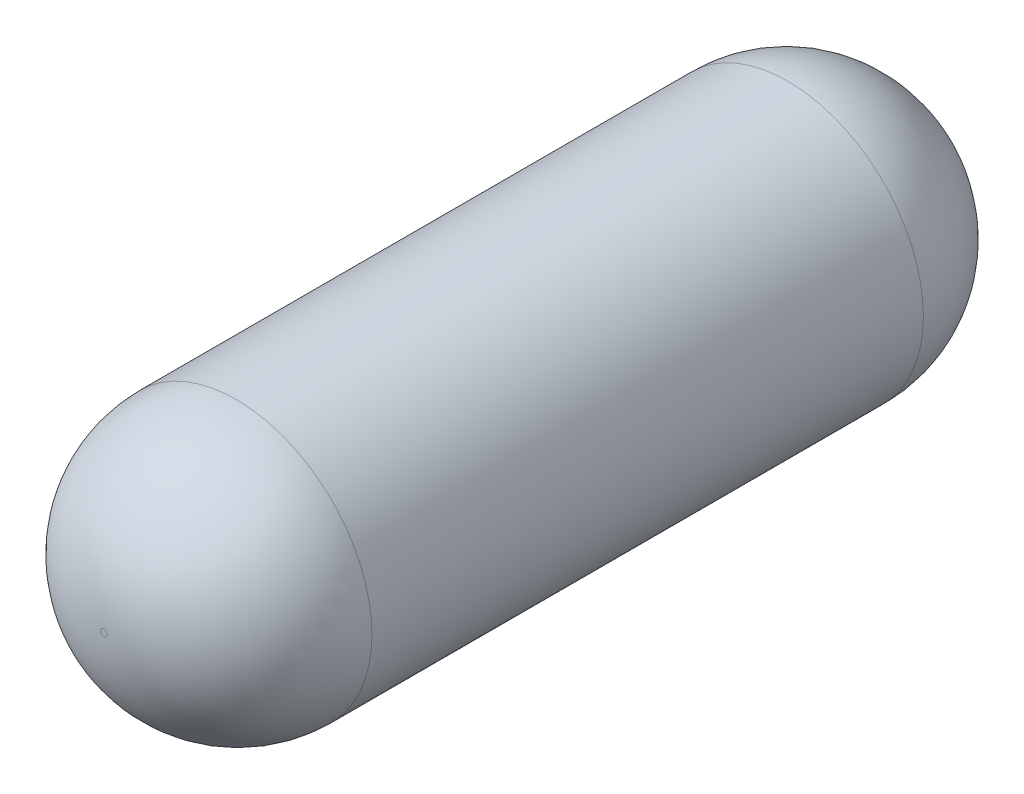
ISO-10303-21;
HEADER;
FILE_DESCRIPTION(('STEP AP214'),'2;1');
FILE_NAME('part.step','',(''),(''),'','','');
FILE_SCHEMA(('AUTOMOTIVE_DESIGN { 1 0 10303 214 1 1 1 1 }'));
ENDSEC;
DATA;
#1=APPLICATION_CONTEXT('core data for automotive mechanical design processes');
#2=APPLICATION_PROTOCOL_DEFINITION('international standard','automotive_design',2000,#1);
#3=PRODUCT_CONTEXT('',#1,'mechanical');
#4=PRODUCT('Part','Part','',(#3));
#5=PRODUCT_RELATED_PRODUCT_CATEGORY('part','',(#4));
#6=PRODUCT_DEFINITION_FORMATION('','',#4);
#7=PRODUCT_DEFINITION_CONTEXT('part definition',#1,'design');
#8=PRODUCT_DEFINITION('design','',#6,#7);
#9=PRODUCT_DEFINITION_SHAPE('','',#8);
#10=(LENGTH_UNIT() NAMED_UNIT(*) SI_UNIT(.MILLI.,.METRE.));
#11=(NAMED_UNIT(*) PLANE_ANGLE_UNIT() SI_UNIT($,.RADIAN.));
#12=(NAMED_UNIT(*) SI_UNIT($,.STERADIAN.) SOLID_ANGLE_UNIT());
#13=UNCERTAINTY_MEASURE_WITH_UNIT(LENGTH_MEASURE(1.E-05),#10,'distance_accuracy_value','');
#14=(GEOMETRIC_REPRESENTATION_CONTEXT(3) GLOBAL_UNCERTAINTY_ASSIGNED_CONTEXT((#13)) GLOBAL_UNIT_ASSIGNED_CONTEXT((#10,
#11,#12)) REPRESENTATION_CONTEXT('',''));
#15=CARTESIAN_POINT('',(0.,0.,0.));
#16=DIRECTION('',(0.,0.,1.));
#17=DIRECTION('',(1.,0.,0.));
#18=AXIS2_PLACEMENT_3D('',#15,#16,#17);
#19=CARTESIAN_POINT('',(0.,0.,370.));
#20=DIRECTION('',(0.,0.,-1.));
#21=DIRECTION('',(-1.,0.,0.));
#22=AXIS2_PLACEMENT_3D('',#19,#20,#21);
#23=CYLINDRICAL_SURFACE('',#22,61.5);
#24=CARTESIAN_POINT('',(0.,0.,60.));
#25=DIRECTION('',(0.,0.,1.));
#26=DIRECTION('',(1.,0.,0.));
#27=AXIS2_PLACEMENT_3D('',#24,#25,#26);
#28=CIRCLE('',#27,61.5);
#29=CARTESIAN_POINT('',(61.5,0.,60.));
#30=VERTEX_POINT('',#29);
#31=EDGE_CURVE('E50',#30,#30,#28,.T.);
#32=ORIENTED_EDGE('',*,*,#31,.T.);
#33=EDGE_LOOP('',(#32));
#34=FACE_BOUND('',#33,.T.);
#35=CARTESIAN_POINT('',(0.,0.,310.));
#36=DIRECTION('',(0.,0.,1.));
#37=DIRECTION('',(1.,0.,0.));
#38=AXIS2_PLACEMENT_3D('',#35,#36,#37);
#39=CIRCLE('',#38,61.5);
#40=CARTESIAN_POINT('',(61.5,0.,310.));
#41=VERTEX_POINT('',#40);
#42=EDGE_CURVE('E54',#41,#41,#39,.F.);
#43=ORIENTED_EDGE('',*,*,#42,.T.);
#44=EDGE_LOOP('',(#43));
#45=FACE_BOUND('',#44,.T.);
#46=ADVANCED_FACE('F39',(#34,#45),#23,.T.);
#47=CARTESIAN_POINT('',(0.,0.,370.));
#48=DIRECTION('',(0.,0.,1.));
#49=DIRECTION('',(1.,0.,0.));
#50=AXIS2_PLACEMENT_3D('',#47,#48,#49);
#51=PLANE('',#50);
#52=CARTESIAN_POINT('',(0.,0.,370.));
#53=DIRECTION('',(0.,0.,1.));
#54=DIRECTION('',(1.,0.,0.));
#55=AXIS2_PLACEMENT_3D('',#52,#53,#54);
#56=CIRCLE('',#55,1.50000000000001);
#57=CARTESIAN_POINT('',(1.50000000000001,0.,370.));
#58=VERTEX_POINT('',#57);
#59=EDGE_CURVE('E10',#58,#58,#56,.T.);
#60=ORIENTED_EDGE('',*,*,#59,.T.);
#61=EDGE_LOOP('',(#60));
#62=FACE_BOUND('',#61,.T.);
#63=ADVANCED_FACE('F70',(#62),#51,.T.);
#64=CARTESIAN_POINT('',(0.,0.,0.));
#65=DIRECTION('',(0.,0.,1.));
#66=DIRECTION('',(1.,0.,0.));
#67=AXIS2_PLACEMENT_3D('',#64,#65,#66);
#68=PLANE('',#67);
#69=CARTESIAN_POINT('',(0.,0.,0.));
#70=DIRECTION('',(0.,0.,1.));
#71=DIRECTION('',(1.,0.,0.));
#72=AXIS2_PLACEMENT_3D('',#69,#70,#71);
#73=CIRCLE('',#72,1.50000000000001);
#74=CARTESIAN_POINT('',(1.50000000000001,0.,0.));
#75=VERTEX_POINT('',#74);
#76=EDGE_CURVE('E46',#75,#75,#73,.F.);
#77=ORIENTED_EDGE('',*,*,#76,.T.);
#78=EDGE_LOOP('',(#77));
#79=FACE_BOUND('',#78,.T.);
#80=ADVANCED_FACE('F67',(#79),#68,.F.);
#81=CARTESIAN_POINT('',(0.,0.,60.));
#82=DIRECTION('',(0.,0.,1.));
#83=DIRECTION('',(1.,0.,0.));
#84=AXIS2_PLACEMENT_3D('',#81,#82,#83);
#85=DEGENERATE_TOROIDAL_SURFACE('',#84,1.50000000000001,60.,.T.);
#86=ORIENTED_EDGE('',*,*,#76,.F.);
#87=EDGE_LOOP('',(#86));
#88=FACE_BOUND('',#87,.T.);
#89=ORIENTED_EDGE('',*,*,#31,.F.);
#90=EDGE_LOOP('',(#89));
#91=FACE_BOUND('',#90,.T.);
#92=ADVANCED_FACE('F63',(#88,#91),#85,.T.);
#93=CARTESIAN_POINT('',(0.,0.,310.));
#94=DIRECTION('',(0.,0.,1.));
#95=DIRECTION('',(1.,0.,0.));
#96=AXIS2_PLACEMENT_3D('',#93,#94,#95);
#97=DEGENERATE_TOROIDAL_SURFACE('',#96,1.50000000000001,60.,.T.);
#98=ORIENTED_EDGE('',*,*,#42,.F.);
#99=EDGE_LOOP('',(#98));
#100=FACE_BOUND('',#99,.T.);
#101=ORIENTED_EDGE('',*,*,#59,.F.);
#102=EDGE_LOOP('',(#101));
#103=FACE_BOUND('',#102,.T.);
#104=ADVANCED_FACE('F41',(#100,#103),#97,.T.);
#105=CLOSED_SHELL('',(#46,#63,#80,#92,#104));
#106=MANIFOLD_SOLID_BREP('B2',#105);
#107=ADVANCED_BREP_SHAPE_REPRESENTATION('',(#18,#106),#14);
#108=SHAPE_DEFINITION_REPRESENTATION(#9,#107);
ENDSEC;
END-ISO-10303-21;
